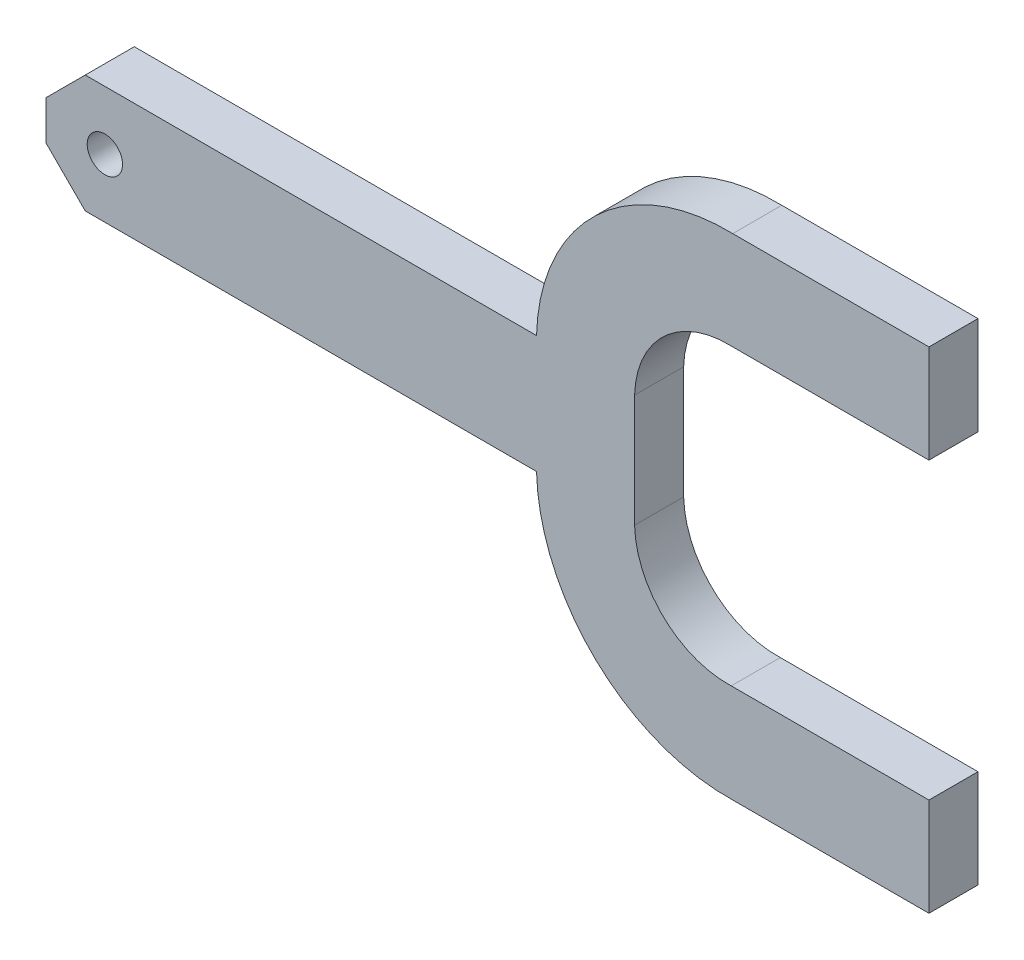
ISO-10303-21;
HEADER;
FILE_DESCRIPTION(('STEP AP214'),'2;1');
FILE_NAME('part.step','',(''),(''),'','','');
FILE_SCHEMA(('AUTOMOTIVE_DESIGN { 1 0 10303 214 1 1 1 1 }'));
ENDSEC;
DATA;
#1=APPLICATION_CONTEXT('core data for automotive mechanical design processes');
#2=APPLICATION_PROTOCOL_DEFINITION('international standard','automotive_design',2000,#1);
#3=PRODUCT_CONTEXT('',#1,'mechanical');
#4=PRODUCT('Part','Part','',(#3));
#5=PRODUCT_RELATED_PRODUCT_CATEGORY('part','',(#4));
#6=PRODUCT_DEFINITION_FORMATION('','',#4);
#7=PRODUCT_DEFINITION_CONTEXT('part definition',#1,'design');
#8=PRODUCT_DEFINITION('design','',#6,#7);
#9=PRODUCT_DEFINITION_SHAPE('','',#8);
#10=(LENGTH_UNIT() NAMED_UNIT(*) SI_UNIT(.MILLI.,.METRE.));
#11=(NAMED_UNIT(*) PLANE_ANGLE_UNIT() SI_UNIT($,.RADIAN.));
#12=(NAMED_UNIT(*) SI_UNIT($,.STERADIAN.) SOLID_ANGLE_UNIT());
#13=UNCERTAINTY_MEASURE_WITH_UNIT(LENGTH_MEASURE(1.E-05),#10,'distance_accuracy_value','');
#14=(GEOMETRIC_REPRESENTATION_CONTEXT(3) GLOBAL_UNCERTAINTY_ASSIGNED_CONTEXT((#13)) GLOBAL_UNIT_ASSIGNED_CONTEXT((#10,
#11,#12)) REPRESENTATION_CONTEXT('',''));
#15=CARTESIAN_POINT('',(0.,0.,0.));
#16=DIRECTION('',(0.,0.,1.));
#17=DIRECTION('',(1.,0.,0.));
#18=AXIS2_PLACEMENT_3D('',#15,#16,#17);
#19=CARTESIAN_POINT('',(0.,0.,5.));
#20=DIRECTION('',(1.,0.,0.));
#21=DIRECTION('',(0.,0.,-1.));
#22=AXIS2_PLACEMENT_3D('',#19,#20,#21);
#23=PLANE('',#22);
#24=DIRECTION('',(0.,-1.,0.));
#25=VECTOR('',#24,1.);
#26=CARTESIAN_POINT('',(0.,0.,0.));
#27=LINE('',#26,#25);
#28=CARTESIAN_POINT('',(0.,8.00000000000001,0.));
#29=VERTEX_POINT('',#28);
#30=CARTESIAN_POINT('',(0.,4.,0.));
#31=VERTEX_POINT('',#30);
#32=EDGE_CURVE('E184',#29,#31,#27,.T.);
#33=ORIENTED_EDGE('',*,*,#32,.T.);
#34=DIRECTION('',(0.,0.,-1.));
#35=VECTOR('',#34,1.);
#36=CARTESIAN_POINT('',(0.,4.,5.));
#37=LINE('',#36,#35);
#38=CARTESIAN_POINT('',(0.,4.,5.));
#39=VERTEX_POINT('',#38);
#40=EDGE_CURVE('E11',#39,#31,#37,.T.);
#41=ORIENTED_EDGE('',*,*,#40,.F.);
#42=DIRECTION('',(0.,-1.,0.));
#43=VECTOR('',#42,1.);
#44=CARTESIAN_POINT('',(0.,0.,5.));
#45=LINE('',#44,#43);
#46=CARTESIAN_POINT('',(0.,8.00000000000001,5.));
#47=VERTEX_POINT('',#46);
#48=EDGE_CURVE('E423',#47,#39,#45,.T.);
#49=ORIENTED_EDGE('',*,*,#48,.F.);
#50=DIRECTION('',(0.,0.,-1.));
#51=VECTOR('',#50,1.);
#52=CARTESIAN_POINT('',(0.,8.00000000000001,5.));
#53=LINE('',#52,#51);
#54=EDGE_CURVE('E177',#47,#29,#53,.T.);
#55=ORIENTED_EDGE('',*,*,#54,.T.);
#56=EDGE_LOOP('',(#33,#41,#49,#55));
#57=FACE_BOUND('',#56,.T.);
#58=ADVANCED_FACE('F35',(#57),#23,.F.);
#59=CARTESIAN_POINT('',(2.,1.99999999999999,5.));
#60=DIRECTION('',(0.707106781186549,0.707106781186546,0.));
#61=DIRECTION('',(-0.707106781186546,0.707106781186549,0.));
#62=AXIS2_PLACEMENT_3D('',#59,#60,#61);
#63=PLANE('',#62);
#64=DIRECTION('',(0.707106781186546,-0.707106781186549,0.));
#65=VECTOR('',#64,1.);
#66=CARTESIAN_POINT('',(2.,1.99999999999999,0.));
#67=LINE('',#66,#65);
#68=CARTESIAN_POINT('',(3.99999999999999,0.,0.));
#69=VERTEX_POINT('',#68);
#70=EDGE_CURVE('E187',#31,#69,#67,.T.);
#71=ORIENTED_EDGE('',*,*,#70,.T.);
#72=DIRECTION('',(0.,0.,-1.));
#73=VECTOR('',#72,1.);
#74=CARTESIAN_POINT('',(3.99999999999999,0.,5.));
#75=LINE('',#74,#73);
#76=CARTESIAN_POINT('',(3.99999999999999,0.,5.));
#77=VERTEX_POINT('',#76);
#78=EDGE_CURVE('E44',#77,#69,#75,.T.);
#79=ORIENTED_EDGE('',*,*,#78,.F.);
#80=DIRECTION('',(0.707106781186546,-0.707106781186549,0.));
#81=VECTOR('',#80,1.);
#82=CARTESIAN_POINT('',(2.,1.99999999999999,5.));
#83=LINE('',#82,#81);
#84=EDGE_CURVE('E119',#39,#77,#83,.T.);
#85=ORIENTED_EDGE('',*,*,#84,.F.);
#86=ORIENTED_EDGE('',*,*,#40,.T.);
#87=EDGE_LOOP('',(#71,#79,#85,#86));
#88=FACE_BOUND('',#87,.T.);
#89=ADVANCED_FACE('F312',(#88),#63,.F.);
#90=CARTESIAN_POINT('',(0.,0.,5.));
#91=DIRECTION('',(0.,1.,0.));
#92=DIRECTION('',(0.,0.,1.));
#93=AXIS2_PLACEMENT_3D('',#90,#91,#92);
#94=PLANE('',#93);
#95=DIRECTION('',(1.,0.,0.));
#96=VECTOR('',#95,1.);
#97=CARTESIAN_POINT('',(0.,0.,0.));
#98=LINE('',#97,#96);
#99=CARTESIAN_POINT('',(50.,0.,0.));
#100=VERTEX_POINT('',#99);
#101=EDGE_CURVE('E189',#69,#100,#98,.T.);
#102=ORIENTED_EDGE('',*,*,#101,.T.);
#103=DIRECTION('',(0.,0.,-1.));
#104=VECTOR('',#103,1.);
#105=CARTESIAN_POINT('',(50.,0.,5.));
#106=LINE('',#105,#104);
#107=CARTESIAN_POINT('',(50.,0.,5.));
#108=VERTEX_POINT('',#107);
#109=EDGE_CURVE('E246',#108,#100,#106,.T.);
#110=ORIENTED_EDGE('',*,*,#109,.F.);
#111=DIRECTION('',(1.,0.,0.));
#112=VECTOR('',#111,1.);
#113=CARTESIAN_POINT('',(0.,0.,5.));
#114=LINE('',#113,#112);
#115=EDGE_CURVE('E253',#77,#108,#114,.T.);
#116=ORIENTED_EDGE('',*,*,#115,.F.);
#117=ORIENTED_EDGE('',*,*,#78,.T.);
#118=EDGE_LOOP('',(#102,#110,#116,#117));
#119=FACE_BOUND('',#118,.T.);
#120=ADVANCED_FACE('F251',(#119),#94,.F.);
#121=CARTESIAN_POINT('',(69.5,0.500000000000016,5.));
#122=DIRECTION('',(0.,0.,-1.));
#123=DIRECTION('',(-1.,0.,0.));
#124=AXIS2_PLACEMENT_3D('',#121,#122,#123);
#125=CYLINDRICAL_SURFACE('',#124,19.5064092031312);
#126=CARTESIAN_POINT('',(69.5,0.500000000000016,0.));
#127=DIRECTION('',(0.,0.,1.));
#128=DIRECTION('',(1.,0.,0.));
#129=AXIS2_PLACEMENT_3D('',#126,#127,#128);
#130=CIRCLE('',#129,19.5064092031312);
#131=CARTESIAN_POINT('',(70.,-19.,0.));
#132=VERTEX_POINT('',#131);
#133=EDGE_CURVE('E192',#132,#100,#130,.F.);
#134=ORIENTED_EDGE('',*,*,#133,.F.);
#135=DIRECTION('',(0.,0.,-1.));
#136=VECTOR('',#135,1.);
#137=CARTESIAN_POINT('',(70.,-19.,5.));
#138=LINE('',#137,#136);
#139=CARTESIAN_POINT('',(70.,-19.,5.));
#140=VERTEX_POINT('',#139);
#141=EDGE_CURVE('E244',#140,#132,#138,.T.);
#142=ORIENTED_EDGE('',*,*,#141,.F.);
#143=CARTESIAN_POINT('',(69.5,0.500000000000016,5.));
#144=DIRECTION('',(0.,0.,1.));
#145=DIRECTION('',(1.,0.,0.));
#146=AXIS2_PLACEMENT_3D('',#143,#144,#145);
#147=CIRCLE('',#146,19.5064092031312);
#148=EDGE_CURVE('E263',#140,#108,#147,.F.);
#149=ORIENTED_EDGE('',*,*,#148,.T.);
#150=ORIENTED_EDGE('',*,*,#109,.T.);
#151=EDGE_LOOP('',(#134,#142,#149,#150));
#152=FACE_BOUND('',#151,.T.);
#153=ADVANCED_FACE('F260',(#152),#125,.T.);
#154=CARTESIAN_POINT('',(0.,-19.,5.));
#155=DIRECTION('',(0.,-1.,0.));
#156=DIRECTION('',(0.,0.,-1.));
#157=AXIS2_PLACEMENT_3D('',#154,#155,#156);
#158=PLANE('',#157);
#159=DIRECTION('',(-1.,0.,0.));
#160=VECTOR('',#159,1.);
#161=CARTESIAN_POINT('',(0.,-19.,0.));
#162=LINE('',#161,#160);
#163=CARTESIAN_POINT('',(90.,-19.,0.));
#164=VERTEX_POINT('',#163);
#165=EDGE_CURVE('E195',#164,#132,#162,.T.);
#166=ORIENTED_EDGE('',*,*,#165,.F.);
#167=DIRECTION('',(0.,0.,-1.));
#168=VECTOR('',#167,1.);
#169=CARTESIAN_POINT('',(90.,-19.,5.));
#170=LINE('',#169,#168);
#171=CARTESIAN_POINT('',(90.,-19.,5.));
#172=VERTEX_POINT('',#171);
#173=EDGE_CURVE('E242',#172,#164,#170,.T.);
#174=ORIENTED_EDGE('',*,*,#173,.F.);
#175=DIRECTION('',(-1.,0.,0.));
#176=VECTOR('',#175,1.);
#177=CARTESIAN_POINT('',(0.,-19.,5.));
#178=LINE('',#177,#176);
#179=EDGE_CURVE('E266',#172,#140,#178,.T.);
#180=ORIENTED_EDGE('',*,*,#179,.T.);
#181=ORIENTED_EDGE('',*,*,#141,.T.);
#182=EDGE_LOOP('',(#166,#174,#180,#181));
#183=FACE_BOUND('',#182,.T.);
#184=ADVANCED_FACE('F323',(#183),#158,.T.);
#185=CARTESIAN_POINT('',(90.,0.,5.));
#186=DIRECTION('',(1.,0.,0.));
#187=DIRECTION('',(0.,0.,-1.));
#188=AXIS2_PLACEMENT_3D('',#185,#186,#187);
#189=PLANE('',#188);
#190=DIRECTION('',(0.,-1.,0.));
#191=VECTOR('',#190,1.);
#192=CARTESIAN_POINT('',(90.,0.,0.));
#193=LINE('',#192,#191);
#194=CARTESIAN_POINT('',(90.,-9.,0.));
#195=VERTEX_POINT('',#194);
#196=EDGE_CURVE('E198',#195,#164,#193,.T.);
#197=ORIENTED_EDGE('',*,*,#196,.F.);
#198=DIRECTION('',(0.,0.,-1.));
#199=VECTOR('',#198,1.);
#200=CARTESIAN_POINT('',(90.,-9.,5.));
#201=LINE('',#200,#199);
#202=CARTESIAN_POINT('',(90.,-9.,5.));
#203=VERTEX_POINT('',#202);
#204=EDGE_CURVE('E240',#203,#195,#201,.T.);
#205=ORIENTED_EDGE('',*,*,#204,.F.);
#206=DIRECTION('',(0.,-1.,0.));
#207=VECTOR('',#206,1.);
#208=CARTESIAN_POINT('',(90.,0.,5.));
#209=LINE('',#208,#207);
#210=EDGE_CURVE('E268',#203,#172,#209,.T.);
#211=ORIENTED_EDGE('',*,*,#210,.T.);
#212=ORIENTED_EDGE('',*,*,#173,.T.);
#213=EDGE_LOOP('',(#197,#205,#211,#212));
#214=FACE_BOUND('',#213,.T.);
#215=ADVANCED_FACE('F326',(#214),#189,.T.);
#216=CARTESIAN_POINT('',(0.,-9.,5.));
#217=DIRECTION('',(0.,-1.,0.));
#218=DIRECTION('',(0.,0.,-1.));
#219=AXIS2_PLACEMENT_3D('',#216,#217,#218);
#220=PLANE('',#219);
#221=DIRECTION('',(-1.,0.,0.));
#222=VECTOR('',#221,1.);
#223=CARTESIAN_POINT('',(0.,-9.,0.));
#224=LINE('',#223,#222);
#225=CARTESIAN_POINT('',(69.8490213995972,-9.,0.));
#226=VERTEX_POINT('',#225);
#227=EDGE_CURVE('E201',#195,#226,#224,.T.);
#228=ORIENTED_EDGE('',*,*,#227,.T.);
#229=DIRECTION('',(0.,0.,-1.));
#230=VECTOR('',#229,1.);
#231=CARTESIAN_POINT('',(69.8490213995972,-9.,5.));
#232=LINE('',#231,#230);
#233=CARTESIAN_POINT('',(69.8490213995972,-9.,5.));
#234=VERTEX_POINT('',#233);
#235=EDGE_CURVE('E237',#234,#226,#232,.T.);
#236=ORIENTED_EDGE('',*,*,#235,.F.);
#237=DIRECTION('',(-1.,0.,0.));
#238=VECTOR('',#237,1.);
#239=CARTESIAN_POINT('',(0.,-9.,5.));
#240=LINE('',#239,#238);
#241=EDGE_CURVE('E275',#203,#234,#240,.T.);
#242=ORIENTED_EDGE('',*,*,#241,.F.);
#243=ORIENTED_EDGE('',*,*,#204,.T.);
#244=EDGE_LOOP('',(#228,#236,#242,#243));
#245=FACE_BOUND('',#244,.T.);
#246=ADVANCED_FACE('F330',(#245),#220,.F.);
#247=CARTESIAN_POINT('',(69.5,0.500000000000016,5.));
#248=DIRECTION('',(0.,0.,-1.));
#249=DIRECTION('',(-1.,0.,0.));
#250=AXIS2_PLACEMENT_3D('',#247,#248,#249);
#251=CYLINDRICAL_SURFACE('',#250,9.50640920313118);
#252=CARTESIAN_POINT('',(69.5,0.500000000000016,0.));
#253=DIRECTION('',(0.,0.,1.));
#254=DIRECTION('',(1.,0.,0.));
#255=AXIS2_PLACEMENT_3D('',#252,#253,#254);
#256=CIRCLE('',#255,9.50640920313118);
#257=CARTESIAN_POINT('',(59.9967143090948,0.256326007925519,0.));
#258=VERTEX_POINT('',#257);
#259=EDGE_CURVE('E203',#226,#258,#256,.F.);
#260=ORIENTED_EDGE('',*,*,#259,.T.);
#261=DIRECTION('',(0.,0.,-1.));
#262=VECTOR('',#261,1.);
#263=CARTESIAN_POINT('',(59.9967143090948,0.256326007925519,5.));
#264=LINE('',#263,#262);
#265=CARTESIAN_POINT('',(59.9967143090948,0.256326007925519,5.));
#266=VERTEX_POINT('',#265);
#267=EDGE_CURVE('E235',#266,#258,#264,.T.);
#268=ORIENTED_EDGE('',*,*,#267,.F.);
#269=CARTESIAN_POINT('',(69.5,0.500000000000016,5.));
#270=DIRECTION('',(0.,0.,1.));
#271=DIRECTION('',(1.,0.,0.));
#272=AXIS2_PLACEMENT_3D('',#269,#270,#271);
#273=CIRCLE('',#272,9.50640920313118);
#274=EDGE_CURVE('E277',#234,#266,#273,.F.);
#275=ORIENTED_EDGE('',*,*,#274,.F.);
#276=ORIENTED_EDGE('',*,*,#235,.T.);
#277=EDGE_LOOP('',(#260,#268,#275,#276));
#278=FACE_BOUND('',#277,.T.);
#279=ADVANCED_FACE('F334',(#278),#251,.F.);
#280=CARTESIAN_POINT('',(59.9967143090948,0.,5.));
#281=DIRECTION('',(1.,0.,0.));
#282=DIRECTION('',(0.,0.,-1.));
#283=AXIS2_PLACEMENT_3D('',#280,#281,#282);
#284=PLANE('',#283);
#285=DIRECTION('',(0.,-1.,0.));
#286=VECTOR('',#285,1.);
#287=CARTESIAN_POINT('',(59.9967143090948,0.,0.));
#288=LINE('',#287,#286);
#289=CARTESIAN_POINT('',(59.9967143090948,11.7436739920745,0.));
#290=VERTEX_POINT('',#289);
#291=EDGE_CURVE('E206',#290,#258,#288,.T.);
#292=ORIENTED_EDGE('',*,*,#291,.F.);
#293=DIRECTION('',(0.,0.,-1.));
#294=VECTOR('',#293,1.);
#295=CARTESIAN_POINT('',(59.9967143090948,11.7436739920745,5.));
#296=LINE('',#295,#294);
#297=CARTESIAN_POINT('',(59.9967143090948,11.7436739920745,5.));
#298=VERTEX_POINT('',#297);
#299=EDGE_CURVE('E233',#298,#290,#296,.T.);
#300=ORIENTED_EDGE('',*,*,#299,.F.);
#301=DIRECTION('',(0.,-1.,0.));
#302=VECTOR('',#301,1.);
#303=CARTESIAN_POINT('',(59.9967143090948,0.,5.));
#304=LINE('',#303,#302);
#305=EDGE_CURVE('E279',#298,#266,#304,.T.);
#306=ORIENTED_EDGE('',*,*,#305,.T.);
#307=ORIENTED_EDGE('',*,*,#267,.T.);
#308=EDGE_LOOP('',(#292,#300,#306,#307));
#309=FACE_BOUND('',#308,.T.);
#310=ADVANCED_FACE('F338',(#309),#284,.T.);
#311=CARTESIAN_POINT('',(69.5,11.5,5.));
#312=DIRECTION('',(0.,0.,-1.));
#313=DIRECTION('',(-1.,0.,0.));
#314=AXIS2_PLACEMENT_3D('',#311,#312,#313);
#315=CYLINDRICAL_SURFACE('',#314,9.50640920313118);
#316=CARTESIAN_POINT('',(69.5,11.5,0.));
#317=DIRECTION('',(0.,0.,1.));
#318=DIRECTION('',(1.,0.,0.));
#319=AXIS2_PLACEMENT_3D('',#316,#317,#318);
#320=CIRCLE('',#319,9.50640920313118);
#321=CARTESIAN_POINT('',(69.8490213995973,21.,0.));
#322=VERTEX_POINT('',#321);
#323=EDGE_CURVE('E209',#322,#290,#320,.T.);
#324=ORIENTED_EDGE('',*,*,#323,.F.);
#325=DIRECTION('',(0.,0.,-1.));
#326=VECTOR('',#325,1.);
#327=CARTESIAN_POINT('',(69.8490213995973,21.,5.));
#328=LINE('',#327,#326);
#329=CARTESIAN_POINT('',(69.8490213995973,21.,5.));
#330=VERTEX_POINT('',#329);
#331=EDGE_CURVE('E231',#330,#322,#328,.T.);
#332=ORIENTED_EDGE('',*,*,#331,.F.);
#333=CARTESIAN_POINT('',(69.5,11.5,5.));
#334=DIRECTION('',(0.,0.,1.));
#335=DIRECTION('',(1.,0.,0.));
#336=AXIS2_PLACEMENT_3D('',#333,#334,#335);
#337=CIRCLE('',#336,9.50640920313118);
#338=EDGE_CURVE('E282',#330,#298,#337,.T.);
#339=ORIENTED_EDGE('',*,*,#338,.T.);
#340=ORIENTED_EDGE('',*,*,#299,.T.);
#341=EDGE_LOOP('',(#324,#332,#339,#340));
#342=FACE_BOUND('',#341,.T.);
#343=ADVANCED_FACE('F342',(#342),#315,.F.);
#344=CARTESIAN_POINT('',(0.,21.,5.));
#345=DIRECTION('',(0.,-1.,0.));
#346=DIRECTION('',(0.,0.,-1.));
#347=AXIS2_PLACEMENT_3D('',#344,#345,#346);
#348=PLANE('',#347);
#349=DIRECTION('',(-1.,0.,0.));
#350=VECTOR('',#349,1.);
#351=CARTESIAN_POINT('',(0.,21.,0.));
#352=LINE('',#351,#350);
#353=CARTESIAN_POINT('',(90.,21.,0.));
#354=VERTEX_POINT('',#353);
#355=EDGE_CURVE('E212',#354,#322,#352,.T.);
#356=ORIENTED_EDGE('',*,*,#355,.F.);
#357=DIRECTION('',(0.,0.,-1.));
#358=VECTOR('',#357,1.);
#359=CARTESIAN_POINT('',(90.,21.,5.));
#360=LINE('',#359,#358);
#361=CARTESIAN_POINT('',(90.,21.,5.));
#362=VERTEX_POINT('',#361);
#363=EDGE_CURVE('E229',#362,#354,#360,.T.);
#364=ORIENTED_EDGE('',*,*,#363,.F.);
#365=DIRECTION('',(-1.,0.,0.));
#366=VECTOR('',#365,1.);
#367=CARTESIAN_POINT('',(0.,21.,5.));
#368=LINE('',#367,#366);
#369=EDGE_CURVE('E285',#362,#330,#368,.T.);
#370=ORIENTED_EDGE('',*,*,#369,.T.);
#371=ORIENTED_EDGE('',*,*,#331,.T.);
#372=EDGE_LOOP('',(#356,#364,#370,#371));
#373=FACE_BOUND('',#372,.T.);
#374=ADVANCED_FACE('F298',(#373),#348,.T.);
#375=CARTESIAN_POINT('',(90.,0.,5.));
#376=DIRECTION('',(1.,0.,0.));
#377=DIRECTION('',(0.,0.,-1.));
#378=AXIS2_PLACEMENT_3D('',#375,#376,#377);
#379=PLANE('',#378);
#380=DIRECTION('',(0.,-1.,0.));
#381=VECTOR('',#380,1.);
#382=CARTESIAN_POINT('',(90.,0.,0.));
#383=LINE('',#382,#381);
#384=CARTESIAN_POINT('',(90.,31.,0.));
#385=VERTEX_POINT('',#384);
#386=EDGE_CURVE('E215',#385,#354,#383,.T.);
#387=ORIENTED_EDGE('',*,*,#386,.F.);
#388=DIRECTION('',(0.,0.,-1.));
#389=VECTOR('',#388,1.);
#390=CARTESIAN_POINT('',(90.,31.,5.));
#391=LINE('',#390,#389);
#392=CARTESIAN_POINT('',(90.,31.,5.));
#393=VERTEX_POINT('',#392);
#394=EDGE_CURVE('E227',#393,#385,#391,.T.);
#395=ORIENTED_EDGE('',*,*,#394,.F.);
#396=DIRECTION('',(0.,-1.,0.));
#397=VECTOR('',#396,1.);
#398=CARTESIAN_POINT('',(90.,0.,5.));
#399=LINE('',#398,#397);
#400=EDGE_CURVE('E288',#393,#362,#399,.T.);
#401=ORIENTED_EDGE('',*,*,#400,.T.);
#402=ORIENTED_EDGE('',*,*,#363,.T.);
#403=EDGE_LOOP('',(#387,#395,#401,#402));
#404=FACE_BOUND('',#403,.T.);
#405=ADVANCED_FACE('F292',(#404),#379,.T.);
#406=CARTESIAN_POINT('',(0.,31.,5.));
#407=DIRECTION('',(0.,-1.,0.));
#408=DIRECTION('',(0.,0.,-1.));
#409=AXIS2_PLACEMENT_3D('',#406,#407,#408);
#410=PLANE('',#409);
#411=DIRECTION('',(-1.,0.,0.));
#412=VECTOR('',#411,1.);
#413=CARTESIAN_POINT('',(0.,31.,0.));
#414=LINE('',#413,#412);
#415=CARTESIAN_POINT('',(70.,31.,0.));
#416=VERTEX_POINT('',#415);
#417=EDGE_CURVE('E218',#385,#416,#414,.T.);
#418=ORIENTED_EDGE('',*,*,#417,.T.);
#419=DIRECTION('',(0.,0.,-1.));
#420=VECTOR('',#419,1.);
#421=CARTESIAN_POINT('',(70.,31.,5.));
#422=LINE('',#421,#420);
#423=CARTESIAN_POINT('',(70.,31.,5.));
#424=VERTEX_POINT('',#423);
#425=EDGE_CURVE('E172',#424,#416,#422,.T.);
#426=ORIENTED_EDGE('',*,*,#425,.F.);
#427=DIRECTION('',(-1.,0.,0.));
#428=VECTOR('',#427,1.);
#429=CARTESIAN_POINT('',(0.,31.,5.));
#430=LINE('',#429,#428);
#431=EDGE_CURVE('E163',#393,#424,#430,.T.);
#432=ORIENTED_EDGE('',*,*,#431,.F.);
#433=ORIENTED_EDGE('',*,*,#394,.T.);
#434=EDGE_LOOP('',(#418,#426,#432,#433));
#435=FACE_BOUND('',#434,.T.);
#436=ADVANCED_FACE('F302',(#435),#410,.F.);
#437=CARTESIAN_POINT('',(69.5,11.5,5.));
#438=DIRECTION('',(0.,0.,-1.));
#439=DIRECTION('',(-1.,0.,0.));
#440=AXIS2_PLACEMENT_3D('',#437,#438,#439);
#441=CYLINDRICAL_SURFACE('',#440,19.5064092031312);
#442=CARTESIAN_POINT('',(69.5,11.5,0.));
#443=DIRECTION('',(0.,0.,1.));
#444=DIRECTION('',(1.,0.,0.));
#445=AXIS2_PLACEMENT_3D('',#442,#443,#444);
#446=CIRCLE('',#445,19.5064092031312);
#447=CARTESIAN_POINT('',(50.,12.,0.));
#448=VERTEX_POINT('',#447);
#449=EDGE_CURVE('E171',#416,#448,#446,.T.);
#450=ORIENTED_EDGE('',*,*,#449,.T.);
#451=DIRECTION('',(0.,0.,-1.));
#452=VECTOR('',#451,1.);
#453=CARTESIAN_POINT('',(50.,12.,5.));
#454=LINE('',#453,#452);
#455=CARTESIAN_POINT('',(50.,12.,5.));
#456=VERTEX_POINT('',#455);
#457=EDGE_CURVE('E168',#456,#448,#454,.T.);
#458=ORIENTED_EDGE('',*,*,#457,.F.);
#459=CARTESIAN_POINT('',(69.5,11.5,5.));
#460=DIRECTION('',(0.,0.,1.));
#461=DIRECTION('',(1.,0.,0.));
#462=AXIS2_PLACEMENT_3D('',#459,#460,#461);
#463=CIRCLE('',#462,19.5064092031312);
#464=EDGE_CURVE('E156',#424,#456,#463,.T.);
#465=ORIENTED_EDGE('',*,*,#464,.F.);
#466=ORIENTED_EDGE('',*,*,#425,.T.);
#467=EDGE_LOOP('',(#450,#458,#465,#466));
#468=FACE_BOUND('',#467,.T.);
#469=ADVANCED_FACE('F169',(#468),#441,.T.);
#470=CARTESIAN_POINT('',(0.,12.,5.));
#471=DIRECTION('',(0.,-1.,0.));
#472=DIRECTION('',(0.,0.,-1.));
#473=AXIS2_PLACEMENT_3D('',#470,#471,#472);
#474=PLANE('',#473);
#475=DIRECTION('',(-1.,0.,0.));
#476=VECTOR('',#475,1.);
#477=CARTESIAN_POINT('',(0.,12.,0.));
#478=LINE('',#477,#476);
#479=CARTESIAN_POINT('',(4.,12.,0.));
#480=VERTEX_POINT('',#479);
#481=EDGE_CURVE('E105',#448,#480,#478,.T.);
#482=ORIENTED_EDGE('',*,*,#481,.T.);
#483=DIRECTION('',(0.,0.,-1.));
#484=VECTOR('',#483,1.);
#485=CARTESIAN_POINT('',(4.,12.,5.));
#486=LINE('',#485,#484);
#487=CARTESIAN_POINT('',(4.,12.,5.));
#488=VERTEX_POINT('',#487);
#489=EDGE_CURVE('E173',#488,#480,#486,.T.);
#490=ORIENTED_EDGE('',*,*,#489,.F.);
#491=DIRECTION('',(-1.,0.,0.));
#492=VECTOR('',#491,1.);
#493=CARTESIAN_POINT('',(0.,12.,5.));
#494=LINE('',#493,#492);
#495=EDGE_CURVE('E160',#456,#488,#494,.T.);
#496=ORIENTED_EDGE('',*,*,#495,.F.);
#497=ORIENTED_EDGE('',*,*,#457,.T.);
#498=EDGE_LOOP('',(#482,#490,#496,#497));
#499=FACE_BOUND('',#498,.T.);
#500=ADVANCED_FACE('F175',(#499),#474,.F.);
#501=CARTESIAN_POINT('',(6.,6.,5.));
#502=DIRECTION('',(0.,0.,-1.));
#503=DIRECTION('',(-1.,0.,0.));
#504=AXIS2_PLACEMENT_3D('',#501,#502,#503);
#505=CYLINDRICAL_SURFACE('',#504,1.8);
#506=CARTESIAN_POINT('',(6.,6.,5.));
#507=DIRECTION('',(0.,0.,1.));
#508=DIRECTION('',(1.,0.,0.));
#509=AXIS2_PLACEMENT_3D('',#506,#507,#508);
#510=CIRCLE('',#509,1.8);
#511=CARTESIAN_POINT('',(7.8,6.,5.));
#512=VERTEX_POINT('',#511);
#513=EDGE_CURVE('E223',#512,#512,#510,.T.);
#514=ORIENTED_EDGE('',*,*,#513,.T.);
#515=EDGE_LOOP('',(#514));
#516=FACE_BOUND('',#515,.T.);
#517=CARTESIAN_POINT('',(6.,6.,0.));
#518=DIRECTION('',(0.,0.,1.));
#519=DIRECTION('',(1.,0.,0.));
#520=AXIS2_PLACEMENT_3D('',#517,#518,#519);
#521=CIRCLE('',#520,1.8);
#522=CARTESIAN_POINT('',(7.8,6.,0.));
#523=VERTEX_POINT('',#522);
#524=EDGE_CURVE('E181',#523,#523,#521,.T.);
#525=ORIENTED_EDGE('',*,*,#524,.F.);
#526=EDGE_LOOP('',(#525));
#527=FACE_BOUND('',#526,.T.);
#528=ADVANCED_FACE('F37',(#516,#527),#505,.F.);
#529=CARTESIAN_POINT('',(-4.00000000000001,4.00000000000002,5.));
#530=DIRECTION('',(0.707106781186546,-0.707106781186549,0.));
#531=DIRECTION('',(0.707106781186549,0.707106781186546,0.));
#532=AXIS2_PLACEMENT_3D('',#529,#530,#531);
#533=PLANE('',#532);
#534=DIRECTION('',(-0.707106781186549,-0.707106781186546,0.));
#535=VECTOR('',#534,1.);
#536=CARTESIAN_POINT('',(-4.00000000000001,4.00000000000002,0.));
#537=LINE('',#536,#535);
#538=EDGE_CURVE('E111',#480,#29,#537,.T.);
#539=ORIENTED_EDGE('',*,*,#538,.T.);
#540=ORIENTED_EDGE('',*,*,#54,.F.);
#541=DIRECTION('',(-0.707106781186549,-0.707106781186546,0.));
#542=VECTOR('',#541,1.);
#543=CARTESIAN_POINT('',(-4.00000000000001,4.00000000000002,5.));
#544=LINE('',#543,#542);
#545=EDGE_CURVE('E52',#488,#47,#544,.T.);
#546=ORIENTED_EDGE('',*,*,#545,.F.);
#547=ORIENTED_EDGE('',*,*,#489,.T.);
#548=EDGE_LOOP('',(#539,#540,#546,#547));
#549=FACE_BOUND('',#548,.T.);
#550=ADVANCED_FACE('F383',(#549),#533,.F.);
#551=CARTESIAN_POINT('',(0.,0.,5.));
#552=DIRECTION('',(0.,0.,1.));
#553=DIRECTION('',(1.,0.,0.));
#554=AXIS2_PLACEMENT_3D('',#551,#552,#553);
#555=PLANE('',#554);
#556=ORIENTED_EDGE('',*,*,#513,.F.);
#557=EDGE_LOOP('',(#556));
#558=FACE_BOUND('',#557,.T.);
#559=ORIENTED_EDGE('',*,*,#48,.T.);
#560=ORIENTED_EDGE('',*,*,#84,.T.);
#561=ORIENTED_EDGE('',*,*,#115,.T.);
#562=ORIENTED_EDGE('',*,*,#148,.F.);
#563=ORIENTED_EDGE('',*,*,#179,.F.);
#564=ORIENTED_EDGE('',*,*,#210,.F.);
#565=ORIENTED_EDGE('',*,*,#241,.T.);
#566=ORIENTED_EDGE('',*,*,#274,.T.);
#567=ORIENTED_EDGE('',*,*,#305,.F.);
#568=ORIENTED_EDGE('',*,*,#338,.F.);
#569=ORIENTED_EDGE('',*,*,#369,.F.);
#570=ORIENTED_EDGE('',*,*,#400,.F.);
#571=ORIENTED_EDGE('',*,*,#431,.T.);
#572=ORIENTED_EDGE('',*,*,#464,.T.);
#573=ORIENTED_EDGE('',*,*,#495,.T.);
#574=ORIENTED_EDGE('',*,*,#545,.T.);
#575=EDGE_LOOP('',(#559,#560,#561,#562,#563,#564,#565,#566,#567,#568,#569,#570,#571,#572,#573,#574));
#576=FACE_BOUND('',#575,.T.);
#577=ADVANCED_FACE('F158',(#558,#576),#555,.T.);
#578=CARTESIAN_POINT('',(0.,0.,0.));
#579=DIRECTION('',(0.,0.,1.));
#580=DIRECTION('',(1.,0.,0.));
#581=AXIS2_PLACEMENT_3D('',#578,#579,#580);
#582=PLANE('',#581);
#583=ORIENTED_EDGE('',*,*,#524,.T.);
#584=EDGE_LOOP('',(#583));
#585=FACE_BOUND('',#584,.T.);
#586=ORIENTED_EDGE('',*,*,#32,.F.);
#587=ORIENTED_EDGE('',*,*,#538,.F.);
#588=ORIENTED_EDGE('',*,*,#481,.F.);
#589=ORIENTED_EDGE('',*,*,#449,.F.);
#590=ORIENTED_EDGE('',*,*,#417,.F.);
#591=ORIENTED_EDGE('',*,*,#386,.T.);
#592=ORIENTED_EDGE('',*,*,#355,.T.);
#593=ORIENTED_EDGE('',*,*,#323,.T.);
#594=ORIENTED_EDGE('',*,*,#291,.T.);
#595=ORIENTED_EDGE('',*,*,#259,.F.);
#596=ORIENTED_EDGE('',*,*,#227,.F.);
#597=ORIENTED_EDGE('',*,*,#196,.T.);
#598=ORIENTED_EDGE('',*,*,#165,.T.);
#599=ORIENTED_EDGE('',*,*,#133,.T.);
#600=ORIENTED_EDGE('',*,*,#101,.F.);
#601=ORIENTED_EDGE('',*,*,#70,.F.);
#602=EDGE_LOOP('',(#586,#587,#588,#589,#590,#591,#592,#593,#594,#595,#596,#597,#598,#599,#600,#601));
#603=FACE_BOUND('',#602,.T.);
#604=ADVANCED_FACE('F256',(#585,#603),#582,.F.);
#605=CLOSED_SHELL('',(#58,#89,#120,#153,#184,#215,#246,#279,#310,#343,#374,#405,#436,#469,#500,
#528,#550,#577,#604));
#606=MANIFOLD_SOLID_BREP('B2',#605);
#607=ADVANCED_BREP_SHAPE_REPRESENTATION('',(#18,#606),#14);
#608=SHAPE_DEFINITION_REPRESENTATION(#9,#607);
ENDSEC;
END-ISO-10303-21;
